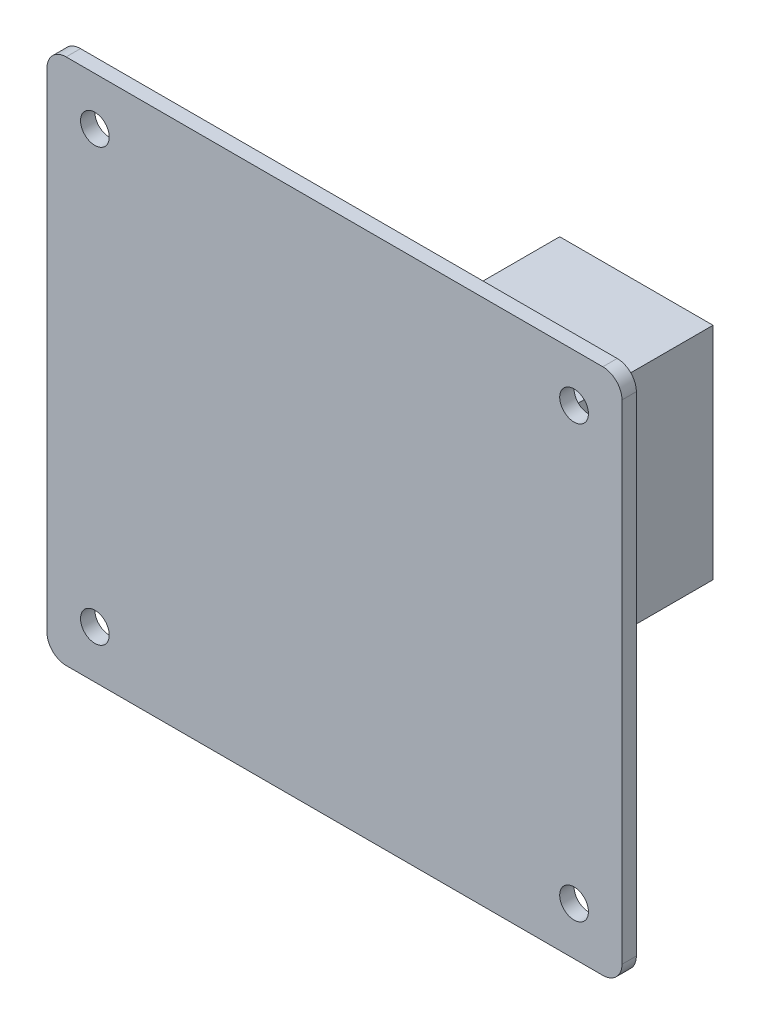
ISO-10303-21;
HEADER;
FILE_DESCRIPTION(('STEP AP214'),'2;1');
FILE_NAME('part.step','',(''),(''),'','','');
FILE_SCHEMA(('AUTOMOTIVE_DESIGN { 1 0 10303 214 1 1 1 1 }'));
ENDSEC;
DATA;
#1=APPLICATION_CONTEXT('core data for automotive mechanical design processes');
#2=APPLICATION_PROTOCOL_DEFINITION('international standard','automotive_design',2000,#1);
#3=PRODUCT_CONTEXT('',#1,'mechanical');
#4=PRODUCT('Part','Part','',(#3));
#5=PRODUCT_RELATED_PRODUCT_CATEGORY('part','',(#4));
#6=PRODUCT_DEFINITION_FORMATION('','',#4);
#7=PRODUCT_DEFINITION_CONTEXT('part definition',#1,'design');
#8=PRODUCT_DEFINITION('design','',#6,#7);
#9=PRODUCT_DEFINITION_SHAPE('','',#8);
#10=(LENGTH_UNIT() NAMED_UNIT(*) SI_UNIT(.MILLI.,.METRE.));
#11=(NAMED_UNIT(*) PLANE_ANGLE_UNIT() SI_UNIT($,.RADIAN.));
#12=(NAMED_UNIT(*) SI_UNIT($,.STERADIAN.) SOLID_ANGLE_UNIT());
#13=UNCERTAINTY_MEASURE_WITH_UNIT(LENGTH_MEASURE(1.E-05),#10,'distance_accuracy_value','');
#14=(GEOMETRIC_REPRESENTATION_CONTEXT(3) GLOBAL_UNCERTAINTY_ASSIGNED_CONTEXT((#13)) GLOBAL_UNIT_ASSIGNED_CONTEXT((#10,
#11,#12)) REPRESENTATION_CONTEXT('',''));
#15=CARTESIAN_POINT('',(0.,0.,0.));
#16=DIRECTION('',(0.,0.,1.));
#17=DIRECTION('',(1.,0.,0.));
#18=AXIS2_PLACEMENT_3D('',#15,#16,#17);
#19=CARTESIAN_POINT('',(0.,0.,0.));
#20=DIRECTION('',(0.,0.,-1.));
#21=DIRECTION('',(-1.,0.,0.));
#22=AXIS2_PLACEMENT_3D('',#19,#20,#21);
#23=PLANE('',#22);
#24=CARTESIAN_POINT('',(55.,5.,0.));
#25=DIRECTION('',(0.,0.,-1.));
#26=DIRECTION('',(-1.,0.,0.));
#27=AXIS2_PLACEMENT_3D('',#24,#25,#26);
#28=CIRCLE('',#27,1.5);
#29=CARTESIAN_POINT('',(53.5,5.,0.));
#30=VERTEX_POINT('',#29);
#31=EDGE_CURVE('E149',#30,#30,#28,.T.);
#32=ORIENTED_EDGE('',*,*,#31,.F.);
#33=EDGE_LOOP('',(#32));
#34=FACE_BOUND('',#33,.T.);
#35=CARTESIAN_POINT('',(55.,50.,0.));
#36=DIRECTION('',(0.,0.,-1.));
#37=DIRECTION('',(-1.,0.,0.));
#38=AXIS2_PLACEMENT_3D('',#35,#36,#37);
#39=CIRCLE('',#38,1.5);
#40=CARTESIAN_POINT('',(53.5,50.,0.));
#41=VERTEX_POINT('',#40);
#42=EDGE_CURVE('E167',#41,#41,#39,.T.);
#43=ORIENTED_EDGE('',*,*,#42,.F.);
#44=EDGE_LOOP('',(#43));
#45=FACE_BOUND('',#44,.T.);
#46=CARTESIAN_POINT('',(5.,50.,0.));
#47=DIRECTION('',(0.,0.,-1.));
#48=DIRECTION('',(-1.,0.,0.));
#49=AXIS2_PLACEMENT_3D('',#46,#47,#48);
#50=CIRCLE('',#49,1.5);
#51=CARTESIAN_POINT('',(3.5,50.,0.));
#52=VERTEX_POINT('',#51);
#53=EDGE_CURVE('E161',#52,#52,#50,.T.);
#54=ORIENTED_EDGE('',*,*,#53,.F.);
#55=EDGE_LOOP('',(#54));
#56=FACE_BOUND('',#55,.T.);
#57=CARTESIAN_POINT('',(4.99999999999999,5.,0.));
#58=DIRECTION('',(0.,0.,-1.));
#59=DIRECTION('',(-1.,0.,0.));
#60=AXIS2_PLACEMENT_3D('',#57,#58,#59);
#61=CIRCLE('',#60,1.5);
#62=CARTESIAN_POINT('',(3.49999999999999,5.,0.));
#63=VERTEX_POINT('',#62);
#64=EDGE_CURVE('E160',#63,#63,#61,.T.);
#65=ORIENTED_EDGE('',*,*,#64,.F.);
#66=EDGE_LOOP('',(#65));
#67=FACE_BOUND('',#66,.T.);
#68=DIRECTION('',(0.,1.,0.));
#69=VECTOR('',#68,1.);
#70=CARTESIAN_POINT('',(60.,0.,0.));
#71=LINE('',#70,#69);
#72=CARTESIAN_POINT('',(60.,2.,0.));
#73=VERTEX_POINT('',#72);
#74=CARTESIAN_POINT('',(60.,53.,0.));
#75=VERTEX_POINT('',#74);
#76=EDGE_CURVE('E196',#73,#75,#71,.T.);
#77=ORIENTED_EDGE('',*,*,#76,.F.);
#78=CARTESIAN_POINT('',(58.,2.,0.));
#79=DIRECTION('',(0.,0.,-1.));
#80=DIRECTION('',(-1.,0.,0.));
#81=AXIS2_PLACEMENT_3D('',#78,#79,#80);
#82=CIRCLE('',#81,2.);
#83=CARTESIAN_POINT('',(58.,0.,0.));
#84=VERTEX_POINT('',#83);
#85=EDGE_CURVE('E210',#73,#84,#82,.T.);
#86=ORIENTED_EDGE('',*,*,#85,.T.);
#87=DIRECTION('',(1.,0.,0.));
#88=VECTOR('',#87,1.);
#89=CARTESIAN_POINT('',(0.,0.,0.));
#90=LINE('',#89,#88);
#91=CARTESIAN_POINT('',(2.,0.,0.));
#92=VERTEX_POINT('',#91);
#93=EDGE_CURVE('E193',#92,#84,#90,.T.);
#94=ORIENTED_EDGE('',*,*,#93,.F.);
#95=CARTESIAN_POINT('',(2.,2.,0.));
#96=DIRECTION('',(0.,0.,-1.));
#97=DIRECTION('',(-1.,0.,0.));
#98=AXIS2_PLACEMENT_3D('',#95,#96,#97);
#99=CIRCLE('',#98,2.);
#100=CARTESIAN_POINT('',(0.,2.,0.));
#101=VERTEX_POINT('',#100);
#102=EDGE_CURVE('E204',#92,#101,#99,.T.);
#103=ORIENTED_EDGE('',*,*,#102,.T.);
#104=DIRECTION('',(0.,-1.,0.));
#105=VECTOR('',#104,1.);
#106=CARTESIAN_POINT('',(0.,0.,0.));
#107=LINE('',#106,#105);
#108=CARTESIAN_POINT('',(0.,53.,0.));
#109=VERTEX_POINT('',#108);
#110=EDGE_CURVE('E175',#109,#101,#107,.T.);
#111=ORIENTED_EDGE('',*,*,#110,.F.);
#112=CARTESIAN_POINT('',(2.,53.,0.));
#113=DIRECTION('',(0.,0.,-1.));
#114=DIRECTION('',(-1.,0.,0.));
#115=AXIS2_PLACEMENT_3D('',#112,#113,#114);
#116=CIRCLE('',#115,2.);
#117=CARTESIAN_POINT('',(2.,55.,0.));
#118=VERTEX_POINT('',#117);
#119=EDGE_CURVE('E206',#109,#118,#116,.T.);
#120=ORIENTED_EDGE('',*,*,#119,.T.);
#121=DIRECTION('',(-1.,0.,0.));
#122=VECTOR('',#121,1.);
#123=CARTESIAN_POINT('',(0.,55.,0.));
#124=LINE('',#123,#122);
#125=CARTESIAN_POINT('',(58.,55.,0.));
#126=VERTEX_POINT('',#125);
#127=EDGE_CURVE('E182',#126,#118,#124,.T.);
#128=ORIENTED_EDGE('',*,*,#127,.F.);
#129=CARTESIAN_POINT('',(58.,53.,0.));
#130=DIRECTION('',(0.,0.,-1.));
#131=DIRECTION('',(-1.,0.,0.));
#132=AXIS2_PLACEMENT_3D('',#129,#130,#131);
#133=CIRCLE('',#132,2.);
#134=EDGE_CURVE('E208',#126,#75,#133,.T.);
#135=ORIENTED_EDGE('',*,*,#134,.T.);
#136=EDGE_LOOP('',(#77,#86,#94,#103,#111,#120,#128,#135));
#137=FACE_BOUND('',#136,.T.);
#138=DIRECTION('',(-1.,0.,0.));
#139=VECTOR('',#138,1.);
#140=CARTESIAN_POINT('',(43.,15.,0.));
#141=LINE('',#140,#139);
#142=CARTESIAN_POINT('',(43.,15.,0.));
#143=VERTEX_POINT('',#142);
#144=CARTESIAN_POINT('',(27.,15.,0.));
#145=VERTEX_POINT('',#144);
#146=EDGE_CURVE('E445',#143,#145,#141,.T.);
#147=ORIENTED_EDGE('',*,*,#146,.F.);
#148=DIRECTION('',(0.,-1.,0.));
#149=VECTOR('',#148,1.);
#150=CARTESIAN_POINT('',(43.,38.,0.));
#151=LINE('',#150,#149);
#152=CARTESIAN_POINT('',(43.,38.,0.));
#153=VERTEX_POINT('',#152);
#154=EDGE_CURVE('E147',#153,#143,#151,.T.);
#155=ORIENTED_EDGE('',*,*,#154,.F.);
#156=DIRECTION('',(1.,0.,0.));
#157=VECTOR('',#156,1.);
#158=CARTESIAN_POINT('',(43.,38.,0.));
#159=LINE('',#158,#157);
#160=CARTESIAN_POINT('',(27.,38.,0.));
#161=VERTEX_POINT('',#160);
#162=EDGE_CURVE('E143',#161,#153,#159,.T.);
#163=ORIENTED_EDGE('',*,*,#162,.F.);
#164=DIRECTION('',(0.,1.,0.));
#165=VECTOR('',#164,1.);
#166=CARTESIAN_POINT('',(27.,38.,0.));
#167=LINE('',#166,#165);
#168=EDGE_CURVE('E442',#145,#161,#167,.T.);
#169=ORIENTED_EDGE('',*,*,#168,.F.);
#170=EDGE_LOOP('',(#147,#155,#163,#169));
#171=FACE_BOUND('',#170,.T.);
#172=ADVANCED_FACE('F33',(#34,#45,#56,#67,#137,#171),#23,.T.);
#173=CARTESIAN_POINT('',(0.,0.,1.5));
#174=DIRECTION('',(1.,0.,0.));
#175=DIRECTION('',(0.,0.,-1.));
#176=AXIS2_PLACEMENT_3D('',#173,#174,#175);
#177=PLANE('',#176);
#178=DIRECTION('',(0.,-1.,0.));
#179=VECTOR('',#178,1.);
#180=CARTESIAN_POINT('',(0.,0.,1.5));
#181=LINE('',#180,#179);
#182=CARTESIAN_POINT('',(0.,53.,1.5));
#183=VERTEX_POINT('',#182);
#184=CARTESIAN_POINT('',(0.,2.,1.5));
#185=VERTEX_POINT('',#184);
#186=EDGE_CURVE('E178',#183,#185,#181,.T.);
#187=ORIENTED_EDGE('',*,*,#186,.F.);
#188=DIRECTION('',(0.,0.,-1.));
#189=VECTOR('',#188,1.);
#190=CARTESIAN_POINT('',(0.,53.,1.5));
#191=LINE('',#190,#189);
#192=EDGE_CURVE('E11',#183,#109,#191,.T.);
#193=ORIENTED_EDGE('',*,*,#192,.T.);
#194=ORIENTED_EDGE('',*,*,#110,.T.);
#195=DIRECTION('',(0.,0.,-1.));
#196=VECTOR('',#195,1.);
#197=CARTESIAN_POINT('',(0.,2.,1.5));
#198=LINE('',#197,#196);
#199=EDGE_CURVE('E41',#101,#185,#198,.F.);
#200=ORIENTED_EDGE('',*,*,#199,.T.);
#201=EDGE_LOOP('',(#187,#193,#194,#200));
#202=FACE_BOUND('',#201,.T.);
#203=ADVANCED_FACE('F231',(#202),#177,.F.);
#204=CARTESIAN_POINT('',(0.,0.,1.5));
#205=DIRECTION('',(0.,1.,0.));
#206=DIRECTION('',(0.,0.,1.));
#207=AXIS2_PLACEMENT_3D('',#204,#205,#206);
#208=PLANE('',#207);
#209=ORIENTED_EDGE('',*,*,#93,.T.);
#210=DIRECTION('',(0.,0.,-1.));
#211=VECTOR('',#210,1.);
#212=CARTESIAN_POINT('',(58.,0.,1.5));
#213=LINE('',#212,#211);
#214=CARTESIAN_POINT('',(58.,0.,1.5));
#215=VERTEX_POINT('',#214);
#216=EDGE_CURVE('E215',#84,#215,#213,.F.);
#217=ORIENTED_EDGE('',*,*,#216,.T.);
#218=DIRECTION('',(1.,0.,0.));
#219=VECTOR('',#218,1.);
#220=CARTESIAN_POINT('',(0.,0.,1.5));
#221=LINE('',#220,#219);
#222=CARTESIAN_POINT('',(2.,0.,1.5));
#223=VERTEX_POINT('',#222);
#224=EDGE_CURVE('E181',#223,#215,#221,.T.);
#225=ORIENTED_EDGE('',*,*,#224,.F.);
#226=DIRECTION('',(0.,0.,-1.));
#227=VECTOR('',#226,1.);
#228=CARTESIAN_POINT('',(2.,0.,1.5));
#229=LINE('',#228,#227);
#230=EDGE_CURVE('E212',#223,#92,#229,.T.);
#231=ORIENTED_EDGE('',*,*,#230,.T.);
#232=EDGE_LOOP('',(#209,#217,#225,#231));
#233=FACE_BOUND('',#232,.T.);
#234=ADVANCED_FACE('F243',(#233),#208,.F.);
#235=CARTESIAN_POINT('',(60.,0.,1.5));
#236=DIRECTION('',(-1.,0.,0.));
#237=DIRECTION('',(0.,0.,1.));
#238=AXIS2_PLACEMENT_3D('',#235,#236,#237);
#239=PLANE('',#238);
#240=DIRECTION('',(0.,1.,0.));
#241=VECTOR('',#240,1.);
#242=CARTESIAN_POINT('',(60.,0.,1.5));
#243=LINE('',#242,#241);
#244=CARTESIAN_POINT('',(60.,2.,1.5));
#245=VERTEX_POINT('',#244);
#246=CARTESIAN_POINT('',(60.,53.,1.5));
#247=VERTEX_POINT('',#246);
#248=EDGE_CURVE('E185',#245,#247,#243,.T.);
#249=ORIENTED_EDGE('',*,*,#248,.F.);
#250=DIRECTION('',(0.,0.,-1.));
#251=VECTOR('',#250,1.);
#252=CARTESIAN_POINT('',(60.,2.,1.5));
#253=LINE('',#252,#251);
#254=EDGE_CURVE('E201',#245,#73,#253,.T.);
#255=ORIENTED_EDGE('',*,*,#254,.T.);
#256=ORIENTED_EDGE('',*,*,#76,.T.);
#257=DIRECTION('',(0.,0.,-1.));
#258=VECTOR('',#257,1.);
#259=CARTESIAN_POINT('',(60.,53.,1.5));
#260=LINE('',#259,#258);
#261=EDGE_CURVE('E190',#75,#247,#260,.F.);
#262=ORIENTED_EDGE('',*,*,#261,.T.);
#263=EDGE_LOOP('',(#249,#255,#256,#262));
#264=FACE_BOUND('',#263,.T.);
#265=ADVANCED_FACE('F254',(#264),#239,.F.);
#266=CARTESIAN_POINT('',(0.,55.,1.5));
#267=DIRECTION('',(0.,-1.,0.));
#268=DIRECTION('',(0.,0.,-1.));
#269=AXIS2_PLACEMENT_3D('',#266,#267,#268);
#270=PLANE('',#269);
#271=DIRECTION('',(-1.,0.,0.));
#272=VECTOR('',#271,1.);
#273=CARTESIAN_POINT('',(0.,55.,1.5));
#274=LINE('',#273,#272);
#275=CARTESIAN_POINT('',(58.,55.,1.5));
#276=VERTEX_POINT('',#275);
#277=CARTESIAN_POINT('',(2.,55.,1.5));
#278=VERTEX_POINT('',#277);
#279=EDGE_CURVE('E188',#276,#278,#274,.T.);
#280=ORIENTED_EDGE('',*,*,#279,.F.);
#281=DIRECTION('',(0.,0.,-1.));
#282=VECTOR('',#281,1.);
#283=CARTESIAN_POINT('',(58.,55.,1.5));
#284=LINE('',#283,#282);
#285=EDGE_CURVE('E226',#276,#126,#284,.T.);
#286=ORIENTED_EDGE('',*,*,#285,.T.);
#287=ORIENTED_EDGE('',*,*,#127,.T.);
#288=DIRECTION('',(0.,0.,-1.));
#289=VECTOR('',#288,1.);
#290=CARTESIAN_POINT('',(2.,55.,1.5));
#291=LINE('',#290,#289);
#292=EDGE_CURVE('E56',#118,#278,#291,.F.);
#293=ORIENTED_EDGE('',*,*,#292,.T.);
#294=EDGE_LOOP('',(#280,#286,#287,#293));
#295=FACE_BOUND('',#294,.T.);
#296=ADVANCED_FACE('F261',(#295),#270,.F.);
#297=CARTESIAN_POINT('',(0.,0.,1.5));
#298=DIRECTION('',(0.,0.,-1.));
#299=DIRECTION('',(-1.,0.,0.));
#300=AXIS2_PLACEMENT_3D('',#297,#298,#299);
#301=PLANE('',#300);
#302=CARTESIAN_POINT('',(55.,5.,1.5));
#303=DIRECTION('',(0.,0.,-1.));
#304=DIRECTION('',(-1.,0.,0.));
#305=AXIS2_PLACEMENT_3D('',#302,#303,#304);
#306=CIRCLE('',#305,1.5);
#307=CARTESIAN_POINT('',(53.5,5.,1.5));
#308=VERTEX_POINT('',#307);
#309=EDGE_CURVE('E152',#308,#308,#306,.T.);
#310=ORIENTED_EDGE('',*,*,#309,.T.);
#311=EDGE_LOOP('',(#310));
#312=FACE_BOUND('',#311,.T.);
#313=CARTESIAN_POINT('',(55.,50.,1.5));
#314=DIRECTION('',(0.,0.,-1.));
#315=DIRECTION('',(-1.,0.,0.));
#316=AXIS2_PLACEMENT_3D('',#313,#314,#315);
#317=CIRCLE('',#316,1.5);
#318=CARTESIAN_POINT('',(53.5,50.,1.5));
#319=VERTEX_POINT('',#318);
#320=EDGE_CURVE('E164',#319,#319,#317,.T.);
#321=ORIENTED_EDGE('',*,*,#320,.T.);
#322=EDGE_LOOP('',(#321));
#323=FACE_BOUND('',#322,.T.);
#324=CARTESIAN_POINT('',(5.,50.,1.5));
#325=DIRECTION('',(0.,0.,-1.));
#326=DIRECTION('',(-1.,0.,0.));
#327=AXIS2_PLACEMENT_3D('',#324,#325,#326);
#328=CIRCLE('',#327,1.5);
#329=CARTESIAN_POINT('',(3.5,50.,1.5));
#330=VERTEX_POINT('',#329);
#331=EDGE_CURVE('E157',#330,#330,#328,.T.);
#332=ORIENTED_EDGE('',*,*,#331,.T.);
#333=EDGE_LOOP('',(#332));
#334=FACE_BOUND('',#333,.T.);
#335=CARTESIAN_POINT('',(4.99999999999999,5.,1.5));
#336=DIRECTION('',(0.,0.,-1.));
#337=DIRECTION('',(-1.,0.,0.));
#338=AXIS2_PLACEMENT_3D('',#335,#336,#337);
#339=CIRCLE('',#338,1.5);
#340=CARTESIAN_POINT('',(3.49999999999999,5.,1.5));
#341=VERTEX_POINT('',#340);
#342=EDGE_CURVE('E172',#341,#341,#339,.T.);
#343=ORIENTED_EDGE('',*,*,#342,.T.);
#344=EDGE_LOOP('',(#343));
#345=FACE_BOUND('',#344,.T.);
#346=ORIENTED_EDGE('',*,*,#224,.T.);
#347=CARTESIAN_POINT('',(58.,2.,1.5));
#348=DIRECTION('',(0.,0.,-1.));
#349=DIRECTION('',(-1.,0.,0.));
#350=AXIS2_PLACEMENT_3D('',#347,#348,#349);
#351=CIRCLE('',#350,2.);
#352=EDGE_CURVE('E223',#215,#245,#351,.F.);
#353=ORIENTED_EDGE('',*,*,#352,.T.);
#354=ORIENTED_EDGE('',*,*,#248,.T.);
#355=CARTESIAN_POINT('',(58.,53.,1.5));
#356=DIRECTION('',(0.,0.,-1.));
#357=DIRECTION('',(-1.,0.,0.));
#358=AXIS2_PLACEMENT_3D('',#355,#356,#357);
#359=CIRCLE('',#358,2.);
#360=EDGE_CURVE('E221',#247,#276,#359,.F.);
#361=ORIENTED_EDGE('',*,*,#360,.T.);
#362=ORIENTED_EDGE('',*,*,#279,.T.);
#363=CARTESIAN_POINT('',(2.,53.,1.5));
#364=DIRECTION('',(0.,0.,-1.));
#365=DIRECTION('',(-1.,0.,0.));
#366=AXIS2_PLACEMENT_3D('',#363,#364,#365);
#367=CIRCLE('',#366,2.);
#368=EDGE_CURVE('E219',#278,#183,#367,.F.);
#369=ORIENTED_EDGE('',*,*,#368,.T.);
#370=ORIENTED_EDGE('',*,*,#186,.T.);
#371=CARTESIAN_POINT('',(2.,2.,1.5));
#372=DIRECTION('',(0.,0.,-1.));
#373=DIRECTION('',(-1.,0.,0.));
#374=AXIS2_PLACEMENT_3D('',#371,#372,#373);
#375=CIRCLE('',#374,2.);
#376=EDGE_CURVE('E217',#185,#223,#375,.F.);
#377=ORIENTED_EDGE('',*,*,#376,.T.);
#378=EDGE_LOOP('',(#346,#353,#354,#361,#362,#369,#370,#377));
#379=FACE_BOUND('',#378,.T.);
#380=ADVANCED_FACE('F237',(#312,#323,#334,#345,#379),#301,.F.);
#381=CARTESIAN_POINT('',(58.,2.,1.5));
#382=DIRECTION('',(0.,0.,-1.));
#383=DIRECTION('',(-1.,0.,0.));
#384=AXIS2_PLACEMENT_3D('',#381,#382,#383);
#385=CYLINDRICAL_SURFACE('',#384,2.);
#386=ORIENTED_EDGE('',*,*,#352,.F.);
#387=ORIENTED_EDGE('',*,*,#216,.F.);
#388=ORIENTED_EDGE('',*,*,#85,.F.);
#389=ORIENTED_EDGE('',*,*,#254,.F.);
#390=EDGE_LOOP('',(#386,#387,#388,#389));
#391=FACE_BOUND('',#390,.T.);
#392=ADVANCED_FACE('F251',(#391),#385,.T.);
#393=CARTESIAN_POINT('',(58.,53.,1.5));
#394=DIRECTION('',(0.,0.,-1.));
#395=DIRECTION('',(-1.,0.,0.));
#396=AXIS2_PLACEMENT_3D('',#393,#394,#395);
#397=CYLINDRICAL_SURFACE('',#396,2.);
#398=ORIENTED_EDGE('',*,*,#360,.F.);
#399=ORIENTED_EDGE('',*,*,#261,.F.);
#400=ORIENTED_EDGE('',*,*,#134,.F.);
#401=ORIENTED_EDGE('',*,*,#285,.F.);
#402=EDGE_LOOP('',(#398,#399,#400,#401));
#403=FACE_BOUND('',#402,.T.);
#404=ADVANCED_FACE('F259',(#403),#397,.T.);
#405=CARTESIAN_POINT('',(2.,53.,1.5));
#406=DIRECTION('',(0.,0.,-1.));
#407=DIRECTION('',(-1.,0.,0.));
#408=AXIS2_PLACEMENT_3D('',#405,#406,#407);
#409=CYLINDRICAL_SURFACE('',#408,2.);
#410=ORIENTED_EDGE('',*,*,#368,.F.);
#411=ORIENTED_EDGE('',*,*,#292,.F.);
#412=ORIENTED_EDGE('',*,*,#119,.F.);
#413=ORIENTED_EDGE('',*,*,#192,.F.);
#414=EDGE_LOOP('',(#410,#411,#412,#413));
#415=FACE_BOUND('',#414,.T.);
#416=ADVANCED_FACE('F263',(#415),#409,.T.);
#417=CARTESIAN_POINT('',(2.,2.,1.5));
#418=DIRECTION('',(0.,0.,-1.));
#419=DIRECTION('',(-1.,0.,0.));
#420=AXIS2_PLACEMENT_3D('',#417,#418,#419);
#421=CYLINDRICAL_SURFACE('',#420,2.);
#422=ORIENTED_EDGE('',*,*,#376,.F.);
#423=ORIENTED_EDGE('',*,*,#199,.F.);
#424=ORIENTED_EDGE('',*,*,#102,.F.);
#425=ORIENTED_EDGE('',*,*,#230,.F.);
#426=EDGE_LOOP('',(#422,#423,#424,#425));
#427=FACE_BOUND('',#426,.T.);
#428=ADVANCED_FACE('F35',(#427),#421,.T.);
#429=CARTESIAN_POINT('',(4.99999999999999,5.,1.5));
#430=DIRECTION('',(0.,0.,-1.));
#431=DIRECTION('',(-1.,0.,0.));
#432=AXIS2_PLACEMENT_3D('',#429,#430,#431);
#433=CYLINDRICAL_SURFACE('',#432,1.5);
#434=ORIENTED_EDGE('',*,*,#342,.F.);
#435=EDGE_LOOP('',(#434));
#436=FACE_BOUND('',#435,.T.);
#437=ORIENTED_EDGE('',*,*,#64,.T.);
#438=EDGE_LOOP('',(#437));
#439=FACE_BOUND('',#438,.T.);
#440=ADVANCED_FACE('F269',(#436,#439),#433,.F.);
#441=CARTESIAN_POINT('',(5.,50.,1.5));
#442=DIRECTION('',(0.,0.,-1.));
#443=DIRECTION('',(-1.,0.,0.));
#444=AXIS2_PLACEMENT_3D('',#441,#442,#443);
#445=CYLINDRICAL_SURFACE('',#444,1.5);
#446=ORIENTED_EDGE('',*,*,#331,.F.);
#447=EDGE_LOOP('',(#446));
#448=FACE_BOUND('',#447,.T.);
#449=ORIENTED_EDGE('',*,*,#53,.T.);
#450=EDGE_LOOP('',(#449));
#451=FACE_BOUND('',#450,.T.);
#452=ADVANCED_FACE('F306',(#448,#451),#445,.F.);
#453=CARTESIAN_POINT('',(55.,50.,1.5));
#454=DIRECTION('',(0.,0.,-1.));
#455=DIRECTION('',(-1.,0.,0.));
#456=AXIS2_PLACEMENT_3D('',#453,#454,#455);
#457=CYLINDRICAL_SURFACE('',#456,1.5);
#458=ORIENTED_EDGE('',*,*,#320,.F.);
#459=EDGE_LOOP('',(#458));
#460=FACE_BOUND('',#459,.T.);
#461=ORIENTED_EDGE('',*,*,#42,.T.);
#462=EDGE_LOOP('',(#461));
#463=FACE_BOUND('',#462,.T.);
#464=ADVANCED_FACE('F312',(#460,#463),#457,.F.);
#465=CARTESIAN_POINT('',(55.,5.,1.5));
#466=DIRECTION('',(0.,0.,-1.));
#467=DIRECTION('',(-1.,0.,0.));
#468=AXIS2_PLACEMENT_3D('',#465,#466,#467);
#469=CYLINDRICAL_SURFACE('',#468,1.5);
#470=ORIENTED_EDGE('',*,*,#309,.F.);
#471=EDGE_LOOP('',(#470));
#472=FACE_BOUND('',#471,.T.);
#473=ORIENTED_EDGE('',*,*,#31,.T.);
#474=EDGE_LOOP('',(#473));
#475=FACE_BOUND('',#474,.T.);
#476=ADVANCED_FACE('F316',(#472,#475),#469,.F.);
#477=CARTESIAN_POINT('',(43.,38.,-25.));
#478=DIRECTION('',(-1.,0.,0.));
#479=DIRECTION('',(0.,-1.,0.));
#480=AXIS2_PLACEMENT_3D('',#477,#478,#479);
#481=PLANE('',#480);
#482=ORIENTED_EDGE('',*,*,#154,.T.);
#483=DIRECTION('',(0.,0.,1.));
#484=VECTOR('',#483,1.);
#485=CARTESIAN_POINT('',(43.,15.,-25.));
#486=LINE('',#485,#484);
#487=CARTESIAN_POINT('',(43.,15.,-25.));
#488=VERTEX_POINT('',#487);
#489=EDGE_CURVE('E128',#488,#143,#486,.T.);
#490=ORIENTED_EDGE('',*,*,#489,.F.);
#491=DIRECTION('',(0.,-1.,0.));
#492=VECTOR('',#491,1.);
#493=CARTESIAN_POINT('',(43.,38.,-25.));
#494=LINE('',#493,#492);
#495=CARTESIAN_POINT('',(43.,38.,-25.));
#496=VERTEX_POINT('',#495);
#497=EDGE_CURVE('E135',#496,#488,#494,.T.);
#498=ORIENTED_EDGE('',*,*,#497,.F.);
#499=DIRECTION('',(0.,0.,1.));
#500=VECTOR('',#499,1.);
#501=CARTESIAN_POINT('',(43.,38.,-25.));
#502=LINE('',#501,#500);
#503=EDGE_CURVE('E440',#496,#153,#502,.T.);
#504=ORIENTED_EDGE('',*,*,#503,.T.);
#505=EDGE_LOOP('',(#482,#490,#498,#504));
#506=FACE_BOUND('',#505,.T.);
#507=ADVANCED_FACE('F145',(#506),#481,.F.);
#508=CARTESIAN_POINT('',(43.,15.,-25.));
#509=DIRECTION('',(0.,1.,0.));
#510=DIRECTION('',(0.,0.,1.));
#511=AXIS2_PLACEMENT_3D('',#508,#509,#510);
#512=PLANE('',#511);
#513=ORIENTED_EDGE('',*,*,#146,.T.);
#514=DIRECTION('',(0.,0.,1.));
#515=VECTOR('',#514,1.);
#516=CARTESIAN_POINT('',(27.,15.,-25.));
#517=LINE('',#516,#515);
#518=CARTESIAN_POINT('',(27.,15.,-25.));
#519=VERTEX_POINT('',#518);
#520=EDGE_CURVE('E131',#519,#145,#517,.T.);
#521=ORIENTED_EDGE('',*,*,#520,.F.);
#522=DIRECTION('',(-1.,0.,0.));
#523=VECTOR('',#522,1.);
#524=CARTESIAN_POINT('',(43.,15.,-25.));
#525=LINE('',#524,#523);
#526=EDGE_CURVE('E124',#488,#519,#525,.T.);
#527=ORIENTED_EDGE('',*,*,#526,.F.);
#528=ORIENTED_EDGE('',*,*,#489,.T.);
#529=EDGE_LOOP('',(#513,#521,#527,#528));
#530=FACE_BOUND('',#529,.T.);
#531=ADVANCED_FACE('F126',(#530),#512,.F.);
#532=CARTESIAN_POINT('',(27.,38.,-25.));
#533=DIRECTION('',(1.,0.,0.));
#534=DIRECTION('',(0.,0.,-1.));
#535=AXIS2_PLACEMENT_3D('',#532,#533,#534);
#536=PLANE('',#535);
#537=ORIENTED_EDGE('',*,*,#168,.T.);
#538=DIRECTION('',(0.,0.,1.));
#539=VECTOR('',#538,1.);
#540=CARTESIAN_POINT('',(27.,38.,-25.));
#541=LINE('',#540,#539);
#542=CARTESIAN_POINT('',(27.,38.,-25.));
#543=VERTEX_POINT('',#542);
#544=EDGE_CURVE('E48',#543,#161,#541,.T.);
#545=ORIENTED_EDGE('',*,*,#544,.F.);
#546=DIRECTION('',(0.,1.,0.));
#547=VECTOR('',#546,1.);
#548=CARTESIAN_POINT('',(27.,38.,-25.));
#549=LINE('',#548,#547);
#550=EDGE_CURVE('E134',#519,#543,#549,.T.);
#551=ORIENTED_EDGE('',*,*,#550,.F.);
#552=ORIENTED_EDGE('',*,*,#520,.T.);
#553=EDGE_LOOP('',(#537,#545,#551,#552));
#554=FACE_BOUND('',#553,.T.);
#555=ADVANCED_FACE('F327',(#554),#536,.F.);
#556=CARTESIAN_POINT('',(43.,38.,-25.));
#557=DIRECTION('',(0.,-1.,0.));
#558=DIRECTION('',(0.,0.,-1.));
#559=AXIS2_PLACEMENT_3D('',#556,#557,#558);
#560=PLANE('',#559);
#561=ORIENTED_EDGE('',*,*,#162,.T.);
#562=ORIENTED_EDGE('',*,*,#503,.F.);
#563=DIRECTION('',(1.,0.,0.));
#564=VECTOR('',#563,1.);
#565=CARTESIAN_POINT('',(43.,38.,-25.));
#566=LINE('',#565,#564);
#567=EDGE_CURVE('E139',#543,#496,#566,.T.);
#568=ORIENTED_EDGE('',*,*,#567,.F.);
#569=ORIENTED_EDGE('',*,*,#544,.T.);
#570=EDGE_LOOP('',(#561,#562,#568,#569));
#571=FACE_BOUND('',#570,.T.);
#572=ADVANCED_FACE('F330',(#571),#560,.F.);
#573=CARTESIAN_POINT('',(0.,0.,-25.));
#574=DIRECTION('',(0.,0.,-1.));
#575=DIRECTION('',(-1.,0.,0.));
#576=AXIS2_PLACEMENT_3D('',#573,#574,#575);
#577=PLANE('',#576);
#578=ORIENTED_EDGE('',*,*,#497,.T.);
#579=ORIENTED_EDGE('',*,*,#526,.T.);
#580=ORIENTED_EDGE('',*,*,#550,.T.);
#581=ORIENTED_EDGE('',*,*,#567,.T.);
#582=EDGE_LOOP('',(#578,#579,#580,#581));
#583=FACE_BOUND('',#582,.T.);
#584=ADVANCED_FACE('F138',(#583),#577,.T.);
#585=CLOSED_SHELL('',(#172,#203,#234,#265,#296,#380,#392,#404,#416,#428,#440,#452,#464,#476,
#507,#531,#555,#572,#584));
#586=MANIFOLD_SOLID_BREP('B2',#585);
#587=ADVANCED_BREP_SHAPE_REPRESENTATION('',(#18,#586),#14);
#588=SHAPE_DEFINITION_REPRESENTATION(#9,#587);
ENDSEC;
END-ISO-10303-21;
